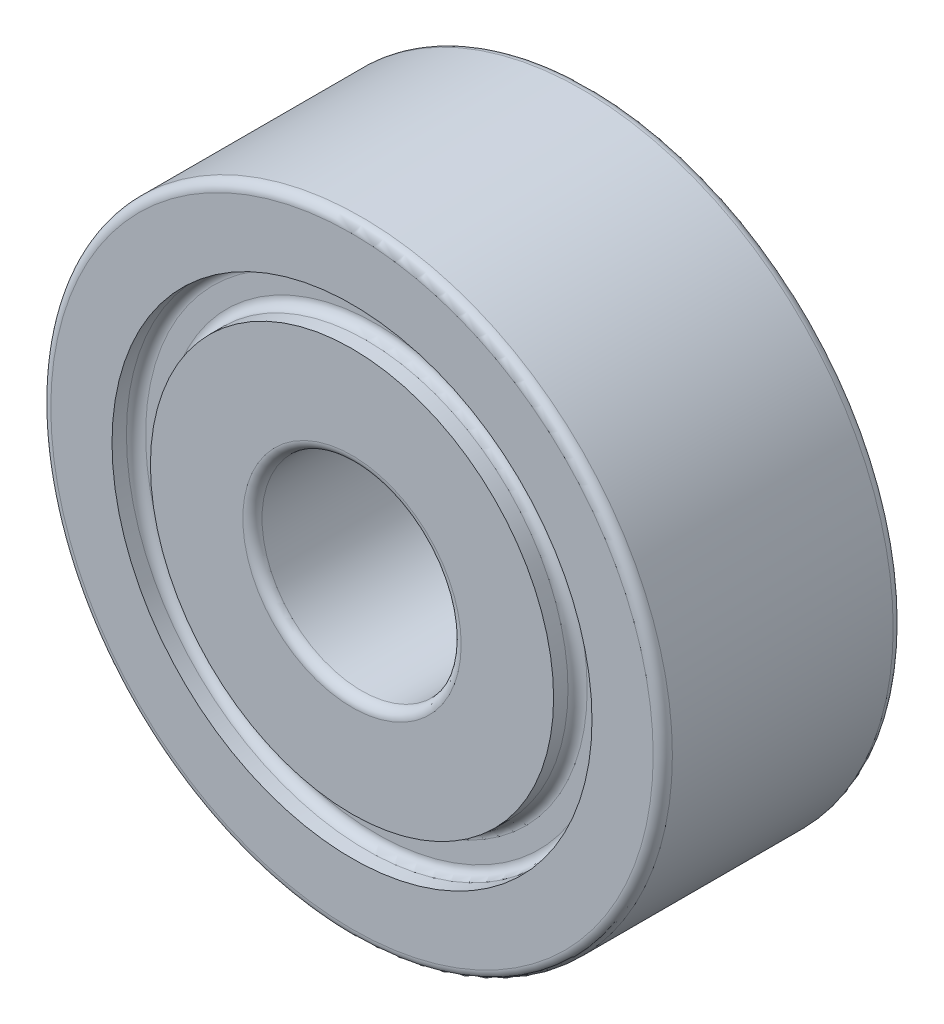
ISO-10303-21;
HEADER;
FILE_DESCRIPTION(('STEP AP214'),'2;1');
FILE_NAME('part.step','',(''),(''),'','','');
FILE_SCHEMA(('AUTOMOTIVE_DESIGN { 1 0 10303 214 1 1 1 1 }'));
ENDSEC;
DATA;
#1=APPLICATION_CONTEXT('core data for automotive mechanical design processes');
#2=APPLICATION_PROTOCOL_DEFINITION('international standard','automotive_design',2000,#1);
#3=PRODUCT_CONTEXT('',#1,'mechanical');
#4=PRODUCT('Part','Part','',(#3));
#5=PRODUCT_RELATED_PRODUCT_CATEGORY('part','',(#4));
#6=PRODUCT_DEFINITION_FORMATION('','',#4);
#7=PRODUCT_DEFINITION_CONTEXT('part definition',#1,'design');
#8=PRODUCT_DEFINITION('design','',#6,#7);
#9=PRODUCT_DEFINITION_SHAPE('','',#8);
#10=(LENGTH_UNIT() NAMED_UNIT(*) SI_UNIT(.MILLI.,.METRE.));
#11=(NAMED_UNIT(*) PLANE_ANGLE_UNIT() SI_UNIT($,.RADIAN.));
#12=(NAMED_UNIT(*) SI_UNIT($,.STERADIAN.) SOLID_ANGLE_UNIT());
#13=UNCERTAINTY_MEASURE_WITH_UNIT(LENGTH_MEASURE(1.E-05),#10,'distance_accuracy_value','');
#14=(GEOMETRIC_REPRESENTATION_CONTEXT(3) GLOBAL_UNCERTAINTY_ASSIGNED_CONTEXT((#13)) GLOBAL_UNIT_ASSIGNED_CONTEXT((#10,
#11,#12)) REPRESENTATION_CONTEXT('',''));
#15=CARTESIAN_POINT('',(0.,0.,0.));
#16=DIRECTION('',(0.,0.,1.));
#17=DIRECTION('',(1.,0.,0.));
#18=AXIS2_PLACEMENT_3D('',#15,#16,#17);
#19=CARTESIAN_POINT('',(0.,0.,0.));
#20=DIRECTION('',(0.,0.,1.));
#21=DIRECTION('',(1.,0.,0.));
#22=AXIS2_PLACEMENT_3D('',#19,#20,#21);
#23=PLANE('',#22);
#24=CARTESIAN_POINT('',(0.,0.,0.));
#25=DIRECTION('',(0.,0.,1.));
#26=DIRECTION('',(1.,0.,0.));
#27=AXIS2_PLACEMENT_3D('',#24,#25,#26);
#28=CIRCLE('',#27,2.275);
#29=CARTESIAN_POINT('',(2.275,0.,0.));
#30=VERTEX_POINT('',#29);
#31=EDGE_CURVE('E72',#30,#30,#28,.T.);
#32=ORIENTED_EDGE('',*,*,#31,.T.);
#33=EDGE_LOOP('',(#32));
#34=FACE_BOUND('',#33,.T.);
#35=CARTESIAN_POINT('',(0.,0.,0.));
#36=DIRECTION('',(0.,0.,-1.));
#37=DIRECTION('',(-1.,0.,0.));
#38=AXIS2_PLACEMENT_3D('',#35,#36,#37);
#39=CIRCLE('',#38,4.2);
#40=CARTESIAN_POINT('',(-4.2,0.,0.));
#41=VERTEX_POINT('',#40);
#42=EDGE_CURVE('E132',#41,#41,#39,.T.);
#43=ORIENTED_EDGE('',*,*,#42,.T.);
#44=EDGE_LOOP('',(#43));
#45=FACE_BOUND('',#44,.T.);
#46=ADVANCED_FACE('F48',(#34,#45),#23,.F.);
#47=CARTESIAN_POINT('',(0.,0.,5.));
#48=DIRECTION('',(0.,0.,1.));
#49=DIRECTION('',(1.,0.,0.));
#50=AXIS2_PLACEMENT_3D('',#47,#48,#49);
#51=PLANE('',#50);
#52=CARTESIAN_POINT('',(0.,0.,5.));
#53=DIRECTION('',(0.,0.,1.));
#54=DIRECTION('',(1.,0.,0.));
#55=AXIS2_PLACEMENT_3D('',#52,#53,#54);
#56=CIRCLE('',#55,2.275);
#57=CARTESIAN_POINT('',(2.275,0.,5.));
#58=VERTEX_POINT('',#57);
#59=EDGE_CURVE('E76',#58,#58,#56,.F.);
#60=ORIENTED_EDGE('',*,*,#59,.T.);
#61=EDGE_LOOP('',(#60));
#62=FACE_BOUND('',#61,.T.);
#63=CARTESIAN_POINT('',(0.,0.,5.));
#64=DIRECTION('',(0.,0.,1.));
#65=DIRECTION('',(1.,0.,0.));
#66=AXIS2_PLACEMENT_3D('',#63,#64,#65);
#67=CIRCLE('',#66,4.2);
#68=CARTESIAN_POINT('',(4.2,0.,5.));
#69=VERTEX_POINT('',#68);
#70=EDGE_CURVE('E124',#69,#69,#67,.T.);
#71=ORIENTED_EDGE('',*,*,#70,.T.);
#72=EDGE_LOOP('',(#71));
#73=FACE_BOUND('',#72,.T.);
#74=ADVANCED_FACE('F155',(#62,#73),#51,.T.);
#75=CARTESIAN_POINT('',(0.,0.,5.));
#76=DIRECTION('',(0.,0.,-1.));
#77=DIRECTION('',(-1.,0.,0.));
#78=AXIS2_PLACEMENT_3D('',#75,#76,#77);
#79=CYLINDRICAL_SURFACE('',#78,6.475);
#80=CARTESIAN_POINT('',(0.,0.,4.8));
#81=DIRECTION('',(0.,0.,1.));
#82=DIRECTION('',(1.,0.,0.));
#83=AXIS2_PLACEMENT_3D('',#80,#81,#82);
#84=CIRCLE('',#83,6.475);
#85=CARTESIAN_POINT('',(6.475,0.,4.8));
#86=VERTEX_POINT('',#85);
#87=EDGE_CURVE('E56',#86,#86,#84,.F.);
#88=ORIENTED_EDGE('',*,*,#87,.T.);
#89=EDGE_LOOP('',(#88));
#90=FACE_BOUND('',#89,.T.);
#91=CARTESIAN_POINT('',(0.,0.,0.2));
#92=DIRECTION('',(0.,0.,1.));
#93=DIRECTION('',(1.,0.,0.));
#94=AXIS2_PLACEMENT_3D('',#91,#92,#93);
#95=CIRCLE('',#94,6.475);
#96=CARTESIAN_POINT('',(6.475,0.,0.2));
#97=VERTEX_POINT('',#96);
#98=EDGE_CURVE('E61',#97,#97,#95,.T.);
#99=ORIENTED_EDGE('',*,*,#98,.T.);
#100=EDGE_LOOP('',(#99));
#101=FACE_BOUND('',#100,.T.);
#102=ADVANCED_FACE('F162',(#90,#101),#79,.T.);
#103=CARTESIAN_POINT('',(0.,0.,5.));
#104=DIRECTION('',(0.,0.,1.));
#105=DIRECTION('',(1.,0.,0.));
#106=AXIS2_PLACEMENT_3D('',#103,#104,#105);
#107=CIRCLE('',#106,6.275);
#108=CARTESIAN_POINT('',(6.275,0.,5.));
#109=VERTEX_POINT('',#108);
#110=EDGE_CURVE('E66',#109,#109,#107,.T.);
#111=ORIENTED_EDGE('',*,*,#110,.T.);
#112=EDGE_LOOP('',(#111));
#113=FACE_BOUND('',#112,.T.);
#114=CARTESIAN_POINT('',(0.,0.,5.));
#115=DIRECTION('',(0.,0.,1.));
#116=DIRECTION('',(1.,0.,0.));
#117=AXIS2_PLACEMENT_3D('',#114,#115,#116);
#118=CIRCLE('',#117,5.);
#119=CARTESIAN_POINT('',(5.,0.,5.));
#120=VERTEX_POINT('',#119);
#121=EDGE_CURVE('E120',#120,#120,#118,.T.);
#122=ORIENTED_EDGE('',*,*,#121,.F.);
#123=EDGE_LOOP('',(#122));
#124=FACE_BOUND('',#123,.T.);
#125=ADVANCED_FACE('F165',(#113,#124),#51,.T.);
#126=CARTESIAN_POINT('',(0.,0.,0.));
#127=DIRECTION('',(0.,0.,1.));
#128=DIRECTION('',(1.,0.,0.));
#129=AXIS2_PLACEMENT_3D('',#126,#127,#128);
#130=CIRCLE('',#129,6.275);
#131=CARTESIAN_POINT('',(6.275,0.,0.));
#132=VERTEX_POINT('',#131);
#133=EDGE_CURVE('E11',#132,#132,#130,.F.);
#134=ORIENTED_EDGE('',*,*,#133,.T.);
#135=EDGE_LOOP('',(#134));
#136=FACE_BOUND('',#135,.T.);
#137=CARTESIAN_POINT('',(0.,0.,0.));
#138=DIRECTION('',(0.,0.,-1.));
#139=DIRECTION('',(-1.,0.,0.));
#140=AXIS2_PLACEMENT_3D('',#137,#138,#139);
#141=CIRCLE('',#140,5.);
#142=CARTESIAN_POINT('',(-5.,0.,0.));
#143=VERTEX_POINT('',#142);
#144=EDGE_CURVE('E128',#143,#143,#141,.T.);
#145=ORIENTED_EDGE('',*,*,#144,.F.);
#146=EDGE_LOOP('',(#145));
#147=FACE_BOUND('',#146,.T.);
#148=ADVANCED_FACE('F158',(#136,#147),#23,.F.);
#149=CARTESIAN_POINT('',(0.,0.,0.));
#150=DIRECTION('',(0.,0.,1.));
#151=DIRECTION('',(1.,0.,0.));
#152=AXIS2_PLACEMENT_3D('',#149,#150,#151);
#153=CYLINDRICAL_SURFACE('',#152,2.075);
#154=CARTESIAN_POINT('',(0.,0.,4.8));
#155=DIRECTION('',(0.,0.,1.));
#156=DIRECTION('',(1.,0.,0.));
#157=AXIS2_PLACEMENT_3D('',#154,#155,#156);
#158=CIRCLE('',#157,2.075);
#159=CARTESIAN_POINT('',(2.075,0.,4.8));
#160=VERTEX_POINT('',#159);
#161=EDGE_CURVE('E80',#160,#160,#158,.T.);
#162=ORIENTED_EDGE('',*,*,#161,.T.);
#163=EDGE_LOOP('',(#162));
#164=FACE_BOUND('',#163,.T.);
#165=CARTESIAN_POINT('',(0.,0.,0.2));
#166=DIRECTION('',(0.,0.,1.));
#167=DIRECTION('',(1.,0.,0.));
#168=AXIS2_PLACEMENT_3D('',#165,#166,#167);
#169=CIRCLE('',#168,2.075);
#170=CARTESIAN_POINT('',(2.075,0.,0.2));
#171=VERTEX_POINT('',#170);
#172=EDGE_CURVE('E84',#171,#171,#169,.F.);
#173=ORIENTED_EDGE('',*,*,#172,.T.);
#174=EDGE_LOOP('',(#173));
#175=FACE_BOUND('',#174,.T.);
#176=ADVANCED_FACE('F168',(#164,#175),#153,.F.);
#177=CARTESIAN_POINT('',(0.,0.,4.5));
#178=DIRECTION('',(0.,0.,1.));
#179=DIRECTION('',(1.,0.,0.));
#180=AXIS2_PLACEMENT_3D('',#177,#178,#179);
#181=CYLINDRICAL_SURFACE('',#180,5.);
#182=CARTESIAN_POINT('',(0.,0.,4.7));
#183=DIRECTION('',(0.,0.,1.));
#184=DIRECTION('',(1.,0.,0.));
#185=AXIS2_PLACEMENT_3D('',#182,#183,#184);
#186=CIRCLE('',#185,5.);
#187=CARTESIAN_POINT('',(5.,0.,4.7));
#188=VERTEX_POINT('',#187);
#189=EDGE_CURVE('E108',#188,#188,#186,.F.);
#190=ORIENTED_EDGE('',*,*,#189,.T.);
#191=EDGE_LOOP('',(#190));
#192=FACE_BOUND('',#191,.T.);
#193=ORIENTED_EDGE('',*,*,#121,.T.);
#194=EDGE_LOOP('',(#193));
#195=FACE_BOUND('',#194,.T.);
#196=ADVANCED_FACE('F173',(#192,#195),#181,.F.);
#197=CARTESIAN_POINT('',(0.,0.,4.5));
#198=DIRECTION('',(0.,0.,1.));
#199=DIRECTION('',(1.,0.,0.));
#200=AXIS2_PLACEMENT_3D('',#197,#198,#199);
#201=PLANE('',#200);
#202=CARTESIAN_POINT('',(0.,0.,4.5));
#203=DIRECTION('',(0.,0.,1.));
#204=DIRECTION('',(1.,0.,0.));
#205=AXIS2_PLACEMENT_3D('',#202,#203,#204);
#206=CIRCLE('',#205,4.8);
#207=CARTESIAN_POINT('',(4.8,0.,4.5));
#208=VERTEX_POINT('',#207);
#209=EDGE_CURVE('E112',#208,#208,#206,.T.);
#210=ORIENTED_EDGE('',*,*,#209,.T.);
#211=EDGE_LOOP('',(#210));
#212=FACE_BOUND('',#211,.T.);
#213=CARTESIAN_POINT('',(0.,0.,4.5));
#214=DIRECTION('',(0.,0.,1.));
#215=DIRECTION('',(1.,0.,0.));
#216=AXIS2_PLACEMENT_3D('',#213,#214,#215);
#217=CIRCLE('',#216,4.4);
#218=CARTESIAN_POINT('',(4.4,0.,4.5));
#219=VERTEX_POINT('',#218);
#220=EDGE_CURVE('E116',#219,#219,#217,.F.);
#221=ORIENTED_EDGE('',*,*,#220,.T.);
#222=EDGE_LOOP('',(#221));
#223=FACE_BOUND('',#222,.T.);
#224=ADVANCED_FACE('F194',(#212,#223),#201,.T.);
#225=CARTESIAN_POINT('',(0.,0.,4.5));
#226=DIRECTION('',(0.,0.,1.));
#227=DIRECTION('',(1.,0.,0.));
#228=AXIS2_PLACEMENT_3D('',#225,#226,#227);
#229=CYLINDRICAL_SURFACE('',#228,4.2);
#230=CARTESIAN_POINT('',(0.,0.,4.7));
#231=DIRECTION('',(0.,0.,1.));
#232=DIRECTION('',(1.,0.,0.));
#233=AXIS2_PLACEMENT_3D('',#230,#231,#232);
#234=CIRCLE('',#233,4.2);
#235=CARTESIAN_POINT('',(4.2,0.,4.7));
#236=VERTEX_POINT('',#235);
#237=EDGE_CURVE('E104',#236,#236,#234,.T.);
#238=ORIENTED_EDGE('',*,*,#237,.T.);
#239=EDGE_LOOP('',(#238));
#240=FACE_BOUND('',#239,.T.);
#241=ORIENTED_EDGE('',*,*,#70,.F.);
#242=EDGE_LOOP('',(#241));
#243=FACE_BOUND('',#242,.T.);
#244=ADVANCED_FACE('F191',(#240,#243),#229,.T.);
#245=CARTESIAN_POINT('',(0.,0.,4.7));
#246=DIRECTION('',(0.,0.,1.));
#247=DIRECTION('',(1.,0.,0.));
#248=AXIS2_PLACEMENT_3D('',#245,#246,#247);
#249=TOROIDAL_SURFACE('',#248,4.8,0.2);
#250=ORIENTED_EDGE('',*,*,#189,.F.);
#251=EDGE_LOOP('',(#250));
#252=FACE_BOUND('',#251,.T.);
#253=ORIENTED_EDGE('',*,*,#209,.F.);
#254=EDGE_LOOP('',(#253));
#255=FACE_BOUND('',#254,.T.);
#256=ADVANCED_FACE('F187',(#252,#255),#249,.F.);
#257=CARTESIAN_POINT('',(0.,0.,4.7));
#258=DIRECTION('',(0.,0.,1.));
#259=DIRECTION('',(1.,0.,0.));
#260=AXIS2_PLACEMENT_3D('',#257,#258,#259);
#261=TOROIDAL_SURFACE('',#260,4.4,0.2);
#262=ORIENTED_EDGE('',*,*,#220,.F.);
#263=EDGE_LOOP('',(#262));
#264=FACE_BOUND('',#263,.T.);
#265=ORIENTED_EDGE('',*,*,#237,.F.);
#266=EDGE_LOOP('',(#265));
#267=FACE_BOUND('',#266,.T.);
#268=ADVANCED_FACE('F181',(#264,#267),#261,.F.);
#269=CARTESIAN_POINT('',(0.,0.,0.5));
#270=DIRECTION('',(0.,0.,-1.));
#271=DIRECTION('',(-1.,0.,0.));
#272=AXIS2_PLACEMENT_3D('',#269,#270,#271);
#273=CYLINDRICAL_SURFACE('',#272,5.);
#274=CARTESIAN_POINT('',(0.,0.,0.3));
#275=DIRECTION('',(0.,0.,-1.));
#276=DIRECTION('',(-1.,0.,0.));
#277=AXIS2_PLACEMENT_3D('',#274,#275,#276);
#278=CIRCLE('',#277,5.);
#279=CARTESIAN_POINT('',(-5.,0.,0.3));
#280=VERTEX_POINT('',#279);
#281=EDGE_CURVE('E92',#280,#280,#278,.F.);
#282=ORIENTED_EDGE('',*,*,#281,.T.);
#283=EDGE_LOOP('',(#282));
#284=FACE_BOUND('',#283,.T.);
#285=ORIENTED_EDGE('',*,*,#144,.T.);
#286=EDGE_LOOP('',(#285));
#287=FACE_BOUND('',#286,.T.);
#288=ADVANCED_FACE('F151',(#284,#287),#273,.F.);
#289=CARTESIAN_POINT('',(0.,0.,0.5));
#290=DIRECTION('',(0.,0.,-1.));
#291=DIRECTION('',(-1.,0.,0.));
#292=AXIS2_PLACEMENT_3D('',#289,#290,#291);
#293=PLANE('',#292);
#294=CARTESIAN_POINT('',(0.,0.,0.5));
#295=DIRECTION('',(0.,0.,-1.));
#296=DIRECTION('',(-1.,0.,0.));
#297=AXIS2_PLACEMENT_3D('',#294,#295,#296);
#298=CIRCLE('',#297,4.8);
#299=CARTESIAN_POINT('',(-4.8,0.,0.5));
#300=VERTEX_POINT('',#299);
#301=EDGE_CURVE('E96',#300,#300,#298,.T.);
#302=ORIENTED_EDGE('',*,*,#301,.T.);
#303=EDGE_LOOP('',(#302));
#304=FACE_BOUND('',#303,.T.);
#305=CARTESIAN_POINT('',(0.,0.,0.5));
#306=DIRECTION('',(0.,0.,-1.));
#307=DIRECTION('',(-1.,0.,0.));
#308=AXIS2_PLACEMENT_3D('',#305,#306,#307);
#309=CIRCLE('',#308,4.4);
#310=CARTESIAN_POINT('',(-4.4,0.,0.5));
#311=VERTEX_POINT('',#310);
#312=EDGE_CURVE('E100',#311,#311,#309,.F.);
#313=ORIENTED_EDGE('',*,*,#312,.T.);
#314=EDGE_LOOP('',(#313));
#315=FACE_BOUND('',#314,.T.);
#316=ADVANCED_FACE('F141',(#304,#315),#293,.T.);
#317=CARTESIAN_POINT('',(0.,0.,0.5));
#318=DIRECTION('',(0.,0.,-1.));
#319=DIRECTION('',(-1.,0.,0.));
#320=AXIS2_PLACEMENT_3D('',#317,#318,#319);
#321=CYLINDRICAL_SURFACE('',#320,4.2);
#322=CARTESIAN_POINT('',(0.,0.,0.3));
#323=DIRECTION('',(0.,0.,-1.));
#324=DIRECTION('',(-1.,0.,0.));
#325=AXIS2_PLACEMENT_3D('',#322,#323,#324);
#326=CIRCLE('',#325,4.2);
#327=CARTESIAN_POINT('',(-4.2,0.,0.3));
#328=VERTEX_POINT('',#327);
#329=EDGE_CURVE('E88',#328,#328,#326,.T.);
#330=ORIENTED_EDGE('',*,*,#329,.T.);
#331=EDGE_LOOP('',(#330));
#332=FACE_BOUND('',#331,.T.);
#333=ORIENTED_EDGE('',*,*,#42,.F.);
#334=EDGE_LOOP('',(#333));
#335=FACE_BOUND('',#334,.T.);
#336=ADVANCED_FACE('F138',(#332,#335),#321,.T.);
#337=CARTESIAN_POINT('',(0.,0.,0.3));
#338=DIRECTION('',(0.,0.,-1.));
#339=DIRECTION('',(-1.,0.,0.));
#340=AXIS2_PLACEMENT_3D('',#337,#338,#339);
#341=TOROIDAL_SURFACE('',#340,4.8,0.2);
#342=ORIENTED_EDGE('',*,*,#281,.F.);
#343=EDGE_LOOP('',(#342));
#344=FACE_BOUND('',#343,.T.);
#345=ORIENTED_EDGE('',*,*,#301,.F.);
#346=EDGE_LOOP('',(#345));
#347=FACE_BOUND('',#346,.T.);
#348=ADVANCED_FACE('F140',(#344,#347),#341,.F.);
#349=CARTESIAN_POINT('',(0.,0.,0.3));
#350=DIRECTION('',(0.,0.,-1.));
#351=DIRECTION('',(-1.,0.,0.));
#352=AXIS2_PLACEMENT_3D('',#349,#350,#351);
#353=TOROIDAL_SURFACE('',#352,4.4,0.2);
#354=ORIENTED_EDGE('',*,*,#312,.F.);
#355=EDGE_LOOP('',(#354));
#356=FACE_BOUND('',#355,.T.);
#357=ORIENTED_EDGE('',*,*,#329,.F.);
#358=EDGE_LOOP('',(#357));
#359=FACE_BOUND('',#358,.T.);
#360=ADVANCED_FACE('F148',(#356,#359),#353,.F.);
#361=CARTESIAN_POINT('',(0.,0.,4.8));
#362=DIRECTION('',(0.,0.,1.));
#363=DIRECTION('',(1.,0.,0.));
#364=AXIS2_PLACEMENT_3D('',#361,#362,#363);
#365=TOROIDAL_SURFACE('',#364,2.275,0.2);
#366=ORIENTED_EDGE('',*,*,#59,.F.);
#367=EDGE_LOOP('',(#366));
#368=FACE_BOUND('',#367,.T.);
#369=ORIENTED_EDGE('',*,*,#161,.F.);
#370=EDGE_LOOP('',(#369));
#371=FACE_BOUND('',#370,.T.);
#372=ADVANCED_FACE('F224',(#368,#371),#365,.T.);
#373=CARTESIAN_POINT('',(0.,0.,0.2));
#374=DIRECTION('',(0.,0.,1.));
#375=DIRECTION('',(1.,0.,0.));
#376=AXIS2_PLACEMENT_3D('',#373,#374,#375);
#377=TOROIDAL_SURFACE('',#376,2.275,0.2);
#378=ORIENTED_EDGE('',*,*,#172,.F.);
#379=EDGE_LOOP('',(#378));
#380=FACE_BOUND('',#379,.T.);
#381=ORIENTED_EDGE('',*,*,#31,.F.);
#382=EDGE_LOOP('',(#381));
#383=FACE_BOUND('',#382,.T.);
#384=ADVANCED_FACE('F228',(#380,#383),#377,.T.);
#385=CARTESIAN_POINT('',(0.,0.,4.8));
#386=DIRECTION('',(0.,0.,1.));
#387=DIRECTION('',(1.,0.,0.));
#388=AXIS2_PLACEMENT_3D('',#385,#386,#387);
#389=TOROIDAL_SURFACE('',#388,6.275,0.2);
#390=ORIENTED_EDGE('',*,*,#87,.F.);
#391=EDGE_LOOP('',(#390));
#392=FACE_BOUND('',#391,.T.);
#393=ORIENTED_EDGE('',*,*,#110,.F.);
#394=EDGE_LOOP('',(#393));
#395=FACE_BOUND('',#394,.T.);
#396=ADVANCED_FACE('F231',(#392,#395),#389,.T.);
#397=CARTESIAN_POINT('',(0.,0.,0.2));
#398=DIRECTION('',(0.,0.,1.));
#399=DIRECTION('',(1.,0.,0.));
#400=AXIS2_PLACEMENT_3D('',#397,#398,#399);
#401=TOROIDAL_SURFACE('',#400,6.275,0.2);
#402=ORIENTED_EDGE('',*,*,#133,.F.);
#403=EDGE_LOOP('',(#402));
#404=FACE_BOUND('',#403,.T.);
#405=ORIENTED_EDGE('',*,*,#98,.F.);
#406=EDGE_LOOP('',(#405));
#407=FACE_BOUND('',#406,.T.);
#408=ADVANCED_FACE('F50',(#404,#407),#401,.T.);
#409=CLOSED_SHELL('',(#46,#74,#102,#125,#148,#176,#196,#224,#244,#256,#268,#288,#316,#336,#348,
#360,#372,#384,#396,#408));
#410=MANIFOLD_SOLID_BREP('B2',#409);
#411=ADVANCED_BREP_SHAPE_REPRESENTATION('',(#18,#410),#14);
#412=SHAPE_DEFINITION_REPRESENTATION(#9,#411);
ENDSEC;
END-ISO-10303-21;
